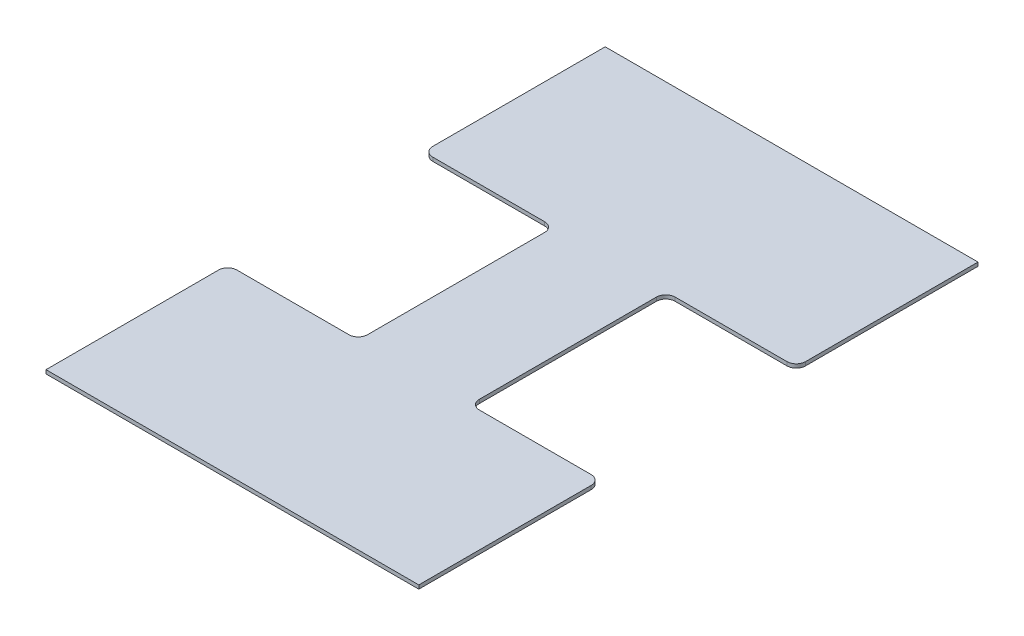
ISO-10303-21;
HEADER;
FILE_DESCRIPTION(('STEP AP214'),'2;1');
FILE_NAME('part.step','',(''),(''),'','','');
FILE_SCHEMA(('AUTOMOTIVE_DESIGN { 1 0 10303 214 1 1 1 1 }'));
ENDSEC;
DATA;
#1=APPLICATION_CONTEXT('core data for automotive mechanical design processes');
#2=APPLICATION_PROTOCOL_DEFINITION('international standard','automotive_design',2000,#1);
#3=PRODUCT_CONTEXT('',#1,'mechanical');
#4=PRODUCT('Part','Part','',(#3));
#5=PRODUCT_RELATED_PRODUCT_CATEGORY('part','',(#4));
#6=PRODUCT_DEFINITION_FORMATION('','',#4);
#7=PRODUCT_DEFINITION_CONTEXT('part definition',#1,'design');
#8=PRODUCT_DEFINITION('design','',#6,#7);
#9=PRODUCT_DEFINITION_SHAPE('','',#8);
#10=(LENGTH_UNIT() NAMED_UNIT(*) SI_UNIT(.MILLI.,.METRE.));
#11=(NAMED_UNIT(*) PLANE_ANGLE_UNIT() SI_UNIT($,.RADIAN.));
#12=(NAMED_UNIT(*) SI_UNIT($,.STERADIAN.) SOLID_ANGLE_UNIT());
#13=UNCERTAINTY_MEASURE_WITH_UNIT(LENGTH_MEASURE(1.E-05),#10,'distance_accuracy_value','');
#14=(GEOMETRIC_REPRESENTATION_CONTEXT(3) GLOBAL_UNCERTAINTY_ASSIGNED_CONTEXT((#13)) GLOBAL_UNIT_ASSIGNED_CONTEXT((#10,
#11,#12)) REPRESENTATION_CONTEXT('',''));
#15=CARTESIAN_POINT('',(0.,0.,0.));
#16=DIRECTION('',(0.,0.,1.));
#17=DIRECTION('',(1.,0.,0.));
#18=AXIS2_PLACEMENT_3D('',#15,#16,#17);
#19=CARTESIAN_POINT('',(200.,4.,300.));
#20=DIRECTION('',(-1.,0.,0.));
#21=DIRECTION('',(0.,0.,1.));
#22=AXIS2_PLACEMENT_3D('',#19,#20,#21);
#23=PLANE('',#22);
#24=DIRECTION('',(0.,0.,-1.));
#25=VECTOR('',#24,1.);
#26=CARTESIAN_POINT('',(200.,4.,300.));
#27=LINE('',#26,#25);
#28=CARTESIAN_POINT('',(200.,4.,-115.));
#29=VERTEX_POINT('',#28);
#30=CARTESIAN_POINT('',(200.,4.,-300.));
#31=VERTEX_POINT('',#30);
#32=EDGE_CURVE('E173',#29,#31,#27,.T.);
#33=ORIENTED_EDGE('',*,*,#32,.F.);
#34=DIRECTION('',(0.,1.,0.));
#35=VECTOR('',#34,1.);
#36=CARTESIAN_POINT('',(200.,0.,-115.));
#37=LINE('',#36,#35);
#38=CARTESIAN_POINT('',(200.,0.,-115.));
#39=VERTEX_POINT('',#38);
#40=EDGE_CURVE('E216',#29,#39,#37,.F.);
#41=ORIENTED_EDGE('',*,*,#40,.T.);
#42=DIRECTION('',(0.,0.,-1.));
#43=VECTOR('',#42,1.);
#44=CARTESIAN_POINT('',(200.,0.,300.));
#45=LINE('',#44,#43);
#46=CARTESIAN_POINT('',(200.,0.,-300.));
#47=VERTEX_POINT('',#46);
#48=EDGE_CURVE('E197',#39,#47,#45,.T.);
#49=ORIENTED_EDGE('',*,*,#48,.T.);
#50=DIRECTION('',(0.,-1.,0.));
#51=VECTOR('',#50,1.);
#52=CARTESIAN_POINT('',(200.,4.,-300.));
#53=LINE('',#52,#51);
#54=EDGE_CURVE('E190',#31,#47,#53,.T.);
#55=ORIENTED_EDGE('',*,*,#54,.F.);
#56=EDGE_LOOP('',(#33,#41,#49,#55));
#57=FACE_BOUND('',#56,.T.);
#58=ADVANCED_FACE('F35',(#57),#23,.F.);
#59=CARTESIAN_POINT('',(200.,0.,300.));
#60=VERTEX_POINT('',#59);
#61=CARTESIAN_POINT('',(200.,0.,115.));
#62=VERTEX_POINT('',#61);
#63=EDGE_CURVE('E305',#60,#62,#45,.T.);
#64=ORIENTED_EDGE('',*,*,#63,.T.);
#65=DIRECTION('',(0.,1.,0.));
#66=VECTOR('',#65,1.);
#67=CARTESIAN_POINT('',(200.,4.,115.));
#68=LINE('',#67,#66);
#69=CARTESIAN_POINT('',(200.,4.,115.));
#70=VERTEX_POINT('',#69);
#71=EDGE_CURVE('E225',#62,#70,#68,.T.);
#72=ORIENTED_EDGE('',*,*,#71,.T.);
#73=CARTESIAN_POINT('',(200.,4.,300.));
#74=VERTEX_POINT('',#73);
#75=EDGE_CURVE('E184',#74,#70,#27,.T.);
#76=ORIENTED_EDGE('',*,*,#75,.F.);
#77=DIRECTION('',(0.,-1.,0.));
#78=VECTOR('',#77,1.);
#79=CARTESIAN_POINT('',(200.,4.,300.));
#80=LINE('',#79,#78);
#81=EDGE_CURVE('E304',#74,#60,#80,.T.);
#82=ORIENTED_EDGE('',*,*,#81,.T.);
#83=EDGE_LOOP('',(#64,#72,#76,#82));
#84=FACE_BOUND('',#83,.T.);
#85=ADVANCED_FACE('F331',(#84),#23,.F.);
#86=CARTESIAN_POINT('',(0.,4.,0.));
#87=DIRECTION('',(0.,-1.,0.));
#88=DIRECTION('',(0.,0.,-1.));
#89=AXIS2_PLACEMENT_3D('',#86,#87,#88);
#90=PLANE('',#89);
#91=DIRECTION('',(1.,0.,0.));
#92=VECTOR('',#91,1.);
#93=CARTESIAN_POINT('',(200.,4.,-105.));
#94=LINE('',#93,#92);
#95=CARTESIAN_POINT('',(70.,4.,-105.));
#96=VERTEX_POINT('',#95);
#97=CARTESIAN_POINT('',(190.,4.,-105.));
#98=VERTEX_POINT('',#97);
#99=EDGE_CURVE('E343',#96,#98,#94,.T.);
#100=ORIENTED_EDGE('',*,*,#99,.T.);
#101=CARTESIAN_POINT('',(190.,4.,-115.));
#102=DIRECTION('',(0.,-1.,0.));
#103=DIRECTION('',(0.,0.,-1.));
#104=AXIS2_PLACEMENT_3D('',#101,#102,#103);
#105=CIRCLE('',#104,10.);
#106=EDGE_CURVE('E180',#98,#29,#105,.F.);
#107=ORIENTED_EDGE('',*,*,#106,.T.);
#108=ORIENTED_EDGE('',*,*,#32,.T.);
#109=DIRECTION('',(-1.,0.,0.));
#110=VECTOR('',#109,1.);
#111=CARTESIAN_POINT('',(-200.,4.,-300.));
#112=LINE('',#111,#110);
#113=CARTESIAN_POINT('',(-200.,4.,-300.));
#114=VERTEX_POINT('',#113);
#115=EDGE_CURVE('E178',#31,#114,#112,.T.);
#116=ORIENTED_EDGE('',*,*,#115,.T.);
#117=DIRECTION('',(0.,0.,1.));
#118=VECTOR('',#117,1.);
#119=CARTESIAN_POINT('',(-200.,4.,300.));
#120=LINE('',#119,#118);
#121=CARTESIAN_POINT('',(-200.,4.,-115.));
#122=VERTEX_POINT('',#121);
#123=EDGE_CURVE('E300',#114,#122,#120,.T.);
#124=ORIENTED_EDGE('',*,*,#123,.T.);
#125=CARTESIAN_POINT('',(-190.,4.,-115.));
#126=DIRECTION('',(0.,-1.,0.));
#127=DIRECTION('',(0.,0.,-1.));
#128=AXIS2_PLACEMENT_3D('',#125,#126,#127);
#129=CIRCLE('',#128,10.);
#130=CARTESIAN_POINT('',(-190.,4.,-105.));
#131=VERTEX_POINT('',#130);
#132=EDGE_CURVE('E209',#122,#131,#129,.F.);
#133=ORIENTED_EDGE('',*,*,#132,.T.);
#134=DIRECTION('',(-1.,0.,0.));
#135=VECTOR('',#134,1.);
#136=CARTESIAN_POINT('',(-200.,4.,-105.));
#137=LINE('',#136,#135);
#138=CARTESIAN_POINT('',(-70.,4.,-105.));
#139=VERTEX_POINT('',#138);
#140=EDGE_CURVE('E272',#139,#131,#137,.T.);
#141=ORIENTED_EDGE('',*,*,#140,.F.);
#142=CARTESIAN_POINT('',(-70.,4.,-95.));
#143=DIRECTION('',(0.,-1.,0.));
#144=DIRECTION('',(0.,0.,-1.));
#145=AXIS2_PLACEMENT_3D('',#142,#143,#144);
#146=CIRCLE('',#145,10.);
#147=CARTESIAN_POINT('',(-60.,4.,-95.));
#148=VERTEX_POINT('',#147);
#149=EDGE_CURVE('E43',#139,#148,#146,.T.);
#150=ORIENTED_EDGE('',*,*,#149,.T.);
#151=DIRECTION('',(0.,0.,-1.));
#152=VECTOR('',#151,1.);
#153=CARTESIAN_POINT('',(-60.,4.,105.));
#154=LINE('',#153,#152);
#155=CARTESIAN_POINT('',(-60.,4.,95.));
#156=VERTEX_POINT('',#155);
#157=EDGE_CURVE('E271',#156,#148,#154,.T.);
#158=ORIENTED_EDGE('',*,*,#157,.F.);
#159=CARTESIAN_POINT('',(-70.,4.,95.));
#160=DIRECTION('',(0.,-1.,0.));
#161=DIRECTION('',(0.,0.,-1.));
#162=AXIS2_PLACEMENT_3D('',#159,#160,#161);
#163=CIRCLE('',#162,10.);
#164=CARTESIAN_POINT('',(-70.,4.,105.));
#165=VERTEX_POINT('',#164);
#166=EDGE_CURVE('E265',#156,#165,#163,.T.);
#167=ORIENTED_EDGE('',*,*,#166,.T.);
#168=DIRECTION('',(1.,0.,0.));
#169=VECTOR('',#168,1.);
#170=CARTESIAN_POINT('',(-200.,4.,105.));
#171=LINE('',#170,#169);
#172=CARTESIAN_POINT('',(-190.,4.,105.));
#173=VERTEX_POINT('',#172);
#174=EDGE_CURVE('E292',#173,#165,#171,.T.);
#175=ORIENTED_EDGE('',*,*,#174,.F.);
#176=CARTESIAN_POINT('',(-190.,4.,115.));
#177=DIRECTION('',(0.,-1.,0.));
#178=DIRECTION('',(0.,0.,-1.));
#179=AXIS2_PLACEMENT_3D('',#176,#177,#178);
#180=CIRCLE('',#179,10.);
#181=CARTESIAN_POINT('',(-200.,4.,115.));
#182=VERTEX_POINT('',#181);
#183=EDGE_CURVE('E211',#173,#182,#180,.F.);
#184=ORIENTED_EDGE('',*,*,#183,.T.);
#185=CARTESIAN_POINT('',(-200.,4.,300.));
#186=VERTEX_POINT('',#185);
#187=EDGE_CURVE('E194',#182,#186,#120,.T.);
#188=ORIENTED_EDGE('',*,*,#187,.T.);
#189=DIRECTION('',(1.,0.,0.));
#190=VECTOR('',#189,1.);
#191=CARTESIAN_POINT('',(-200.,4.,300.));
#192=LINE('',#191,#190);
#193=EDGE_CURVE('E302',#186,#74,#192,.T.);
#194=ORIENTED_EDGE('',*,*,#193,.T.);
#195=ORIENTED_EDGE('',*,*,#75,.T.);
#196=CARTESIAN_POINT('',(190.,4.,115.));
#197=DIRECTION('',(0.,-1.,0.));
#198=DIRECTION('',(0.,0.,-1.));
#199=AXIS2_PLACEMENT_3D('',#196,#197,#198);
#200=CIRCLE('',#199,10.);
#201=CARTESIAN_POINT('',(190.,4.,105.));
#202=VERTEX_POINT('',#201);
#203=EDGE_CURVE('E213',#70,#202,#200,.F.);
#204=ORIENTED_EDGE('',*,*,#203,.T.);
#205=DIRECTION('',(-1.,0.,0.));
#206=VECTOR('',#205,1.);
#207=CARTESIAN_POINT('',(200.,4.,105.));
#208=LINE('',#207,#206);
#209=CARTESIAN_POINT('',(70.,4.,105.));
#210=VERTEX_POINT('',#209);
#211=EDGE_CURVE('E338',#202,#210,#208,.T.);
#212=ORIENTED_EDGE('',*,*,#211,.T.);
#213=CARTESIAN_POINT('',(70.,4.,95.));
#214=DIRECTION('',(0.,-1.,0.));
#215=DIRECTION('',(0.,0.,-1.));
#216=AXIS2_PLACEMENT_3D('',#213,#214,#215);
#217=CIRCLE('',#216,10.);
#218=CARTESIAN_POINT('',(60.,4.,95.));
#219=VERTEX_POINT('',#218);
#220=EDGE_CURVE('E257',#210,#219,#217,.T.);
#221=ORIENTED_EDGE('',*,*,#220,.T.);
#222=DIRECTION('',(0.,0.,-1.));
#223=VECTOR('',#222,1.);
#224=CARTESIAN_POINT('',(60.,4.,105.));
#225=LINE('',#224,#223);
#226=CARTESIAN_POINT('',(60.,4.,-95.));
#227=VERTEX_POINT('',#226);
#228=EDGE_CURVE('E344',#219,#227,#225,.T.);
#229=ORIENTED_EDGE('',*,*,#228,.T.);
#230=CARTESIAN_POINT('',(70.,4.,-95.));
#231=DIRECTION('',(0.,-1.,0.));
#232=DIRECTION('',(0.,0.,-1.));
#233=AXIS2_PLACEMENT_3D('',#230,#231,#232);
#234=CIRCLE('',#233,10.);
#235=EDGE_CURVE('E261',#227,#96,#234,.T.);
#236=ORIENTED_EDGE('',*,*,#235,.T.);
#237=EDGE_LOOP('',(#100,#107,#108,#116,#124,#133,#141,#150,#158,#167,#175,#184,#188,#194,#195,
#204,#212,#221,#229,#236));
#238=FACE_BOUND('',#237,.T.);
#239=ADVANCED_FACE('F176',(#238),#90,.F.);
#240=CARTESIAN_POINT('',(0.,0.,0.));
#241=DIRECTION('',(0.,-1.,0.));
#242=DIRECTION('',(0.,0.,-1.));
#243=AXIS2_PLACEMENT_3D('',#240,#241,#242);
#244=PLANE('',#243);
#245=ORIENTED_EDGE('',*,*,#48,.F.);
#246=CARTESIAN_POINT('',(190.,0.,-115.));
#247=DIRECTION('',(0.,-1.,0.));
#248=DIRECTION('',(0.,0.,-1.));
#249=AXIS2_PLACEMENT_3D('',#246,#247,#248);
#250=CIRCLE('',#249,10.);
#251=CARTESIAN_POINT('',(190.,0.,-105.));
#252=VERTEX_POINT('',#251);
#253=EDGE_CURVE('E223',#39,#252,#250,.T.);
#254=ORIENTED_EDGE('',*,*,#253,.T.);
#255=DIRECTION('',(1.,0.,0.));
#256=VECTOR('',#255,1.);
#257=CARTESIAN_POINT('',(200.,0.,-105.));
#258=LINE('',#257,#256);
#259=CARTESIAN_POINT('',(70.,0.,-105.));
#260=VERTEX_POINT('',#259);
#261=EDGE_CURVE('E281',#260,#252,#258,.T.);
#262=ORIENTED_EDGE('',*,*,#261,.F.);
#263=CARTESIAN_POINT('',(70.,0.,-95.));
#264=DIRECTION('',(0.,-1.,0.));
#265=DIRECTION('',(0.,0.,-1.));
#266=AXIS2_PLACEMENT_3D('',#263,#264,#265);
#267=CIRCLE('',#266,10.);
#268=CARTESIAN_POINT('',(60.,0.,-95.));
#269=VERTEX_POINT('',#268);
#270=EDGE_CURVE('E263',#260,#269,#267,.F.);
#271=ORIENTED_EDGE('',*,*,#270,.T.);
#272=DIRECTION('',(0.,0.,-1.));
#273=VECTOR('',#272,1.);
#274=CARTESIAN_POINT('',(60.,0.,105.));
#275=LINE('',#274,#273);
#276=CARTESIAN_POINT('',(60.,0.,95.));
#277=VERTEX_POINT('',#276);
#278=EDGE_CURVE('E346',#277,#269,#275,.T.);
#279=ORIENTED_EDGE('',*,*,#278,.F.);
#280=CARTESIAN_POINT('',(70.,0.,95.));
#281=DIRECTION('',(0.,-1.,0.));
#282=DIRECTION('',(0.,0.,-1.));
#283=AXIS2_PLACEMENT_3D('',#280,#281,#282);
#284=CIRCLE('',#283,10.);
#285=CARTESIAN_POINT('',(70.,0.,105.));
#286=VERTEX_POINT('',#285);
#287=EDGE_CURVE('E259',#277,#286,#284,.F.);
#288=ORIENTED_EDGE('',*,*,#287,.T.);
#289=DIRECTION('',(-1.,0.,0.));
#290=VECTOR('',#289,1.);
#291=CARTESIAN_POINT('',(200.,0.,105.));
#292=LINE('',#291,#290);
#293=CARTESIAN_POINT('',(190.,0.,105.));
#294=VERTEX_POINT('',#293);
#295=EDGE_CURVE('E352',#294,#286,#292,.T.);
#296=ORIENTED_EDGE('',*,*,#295,.F.);
#297=CARTESIAN_POINT('',(190.,0.,115.));
#298=DIRECTION('',(0.,-1.,0.));
#299=DIRECTION('',(0.,0.,-1.));
#300=AXIS2_PLACEMENT_3D('',#297,#298,#299);
#301=CIRCLE('',#300,10.);
#302=EDGE_CURVE('E221',#294,#62,#301,.T.);
#303=ORIENTED_EDGE('',*,*,#302,.T.);
#304=ORIENTED_EDGE('',*,*,#63,.F.);
#305=DIRECTION('',(1.,0.,0.));
#306=VECTOR('',#305,1.);
#307=CARTESIAN_POINT('',(-200.,0.,300.));
#308=LINE('',#307,#306);
#309=CARTESIAN_POINT('',(-200.,0.,300.));
#310=VERTEX_POINT('',#309);
#311=EDGE_CURVE('E185',#310,#60,#308,.T.);
#312=ORIENTED_EDGE('',*,*,#311,.F.);
#313=DIRECTION('',(0.,0.,1.));
#314=VECTOR('',#313,1.);
#315=CARTESIAN_POINT('',(-200.,0.,300.));
#316=LINE('',#315,#314);
#317=CARTESIAN_POINT('',(-200.,0.,115.));
#318=VERTEX_POINT('',#317);
#319=EDGE_CURVE('E310',#318,#310,#316,.T.);
#320=ORIENTED_EDGE('',*,*,#319,.F.);
#321=CARTESIAN_POINT('',(-190.,0.,115.));
#322=DIRECTION('',(0.,-1.,0.));
#323=DIRECTION('',(0.,0.,-1.));
#324=AXIS2_PLACEMENT_3D('',#321,#322,#323);
#325=CIRCLE('',#324,10.);
#326=CARTESIAN_POINT('',(-190.,0.,105.));
#327=VERTEX_POINT('',#326);
#328=EDGE_CURVE('E219',#318,#327,#325,.T.);
#329=ORIENTED_EDGE('',*,*,#328,.T.);
#330=DIRECTION('',(1.,0.,0.));
#331=VECTOR('',#330,1.);
#332=CARTESIAN_POINT('',(-200.,0.,105.));
#333=LINE('',#332,#331);
#334=CARTESIAN_POINT('',(-70.,0.,105.));
#335=VERTEX_POINT('',#334);
#336=EDGE_CURVE('E288',#327,#335,#333,.T.);
#337=ORIENTED_EDGE('',*,*,#336,.T.);
#338=CARTESIAN_POINT('',(-70.,0.,95.));
#339=DIRECTION('',(0.,-1.,0.));
#340=DIRECTION('',(0.,0.,-1.));
#341=AXIS2_PLACEMENT_3D('',#338,#339,#340);
#342=CIRCLE('',#341,10.);
#343=CARTESIAN_POINT('',(-60.,0.,95.));
#344=VERTEX_POINT('',#343);
#345=EDGE_CURVE('E267',#335,#344,#342,.F.);
#346=ORIENTED_EDGE('',*,*,#345,.T.);
#347=DIRECTION('',(0.,0.,-1.));
#348=VECTOR('',#347,1.);
#349=CARTESIAN_POINT('',(-60.,0.,105.));
#350=LINE('',#349,#348);
#351=CARTESIAN_POINT('',(-60.,0.,-95.));
#352=VERTEX_POINT('',#351);
#353=EDGE_CURVE('E286',#344,#352,#350,.T.);
#354=ORIENTED_EDGE('',*,*,#353,.T.);
#355=CARTESIAN_POINT('',(-70.,0.,-95.));
#356=DIRECTION('',(0.,-1.,0.));
#357=DIRECTION('',(0.,0.,-1.));
#358=AXIS2_PLACEMENT_3D('',#355,#356,#357);
#359=CIRCLE('',#358,10.);
#360=CARTESIAN_POINT('',(-70.,0.,-105.));
#361=VERTEX_POINT('',#360);
#362=EDGE_CURVE('E11',#352,#361,#359,.F.);
#363=ORIENTED_EDGE('',*,*,#362,.T.);
#364=DIRECTION('',(-1.,0.,0.));
#365=VECTOR('',#364,1.);
#366=CARTESIAN_POINT('',(-200.,0.,-105.));
#367=LINE('',#366,#365);
#368=CARTESIAN_POINT('',(-190.,0.,-105.));
#369=VERTEX_POINT('',#368);
#370=EDGE_CURVE('E285',#361,#369,#367,.T.);
#371=ORIENTED_EDGE('',*,*,#370,.T.);
#372=CARTESIAN_POINT('',(-190.,0.,-115.));
#373=DIRECTION('',(0.,-1.,0.));
#374=DIRECTION('',(0.,0.,-1.));
#375=AXIS2_PLACEMENT_3D('',#372,#373,#374);
#376=CIRCLE('',#375,10.);
#377=CARTESIAN_POINT('',(-200.,0.,-115.));
#378=VERTEX_POINT('',#377);
#379=EDGE_CURVE('E50',#369,#378,#376,.T.);
#380=ORIENTED_EDGE('',*,*,#379,.T.);
#381=CARTESIAN_POINT('',(-200.,0.,-300.));
#382=VERTEX_POINT('',#381);
#383=EDGE_CURVE('E311',#382,#378,#316,.T.);
#384=ORIENTED_EDGE('',*,*,#383,.F.);
#385=DIRECTION('',(-1.,0.,0.));
#386=VECTOR('',#385,1.);
#387=CARTESIAN_POINT('',(-200.,0.,-300.));
#388=LINE('',#387,#386);
#389=EDGE_CURVE('E308',#47,#382,#388,.T.);
#390=ORIENTED_EDGE('',*,*,#389,.F.);
#391=EDGE_LOOP('',(#245,#254,#262,#271,#279,#288,#296,#303,#304,#312,#320,#329,#337,#346,#354,
#363,#371,#380,#384,#390));
#392=FACE_BOUND('',#391,.T.);
#393=ADVANCED_FACE('F284',(#392),#244,.T.);
#394=CARTESIAN_POINT('',(-200.,4.,300.));
#395=DIRECTION('',(1.,0.,0.));
#396=DIRECTION('',(0.,0.,-1.));
#397=AXIS2_PLACEMENT_3D('',#394,#395,#396);
#398=PLANE('',#397);
#399=ORIENTED_EDGE('',*,*,#187,.F.);
#400=DIRECTION('',(0.,1.,0.));
#401=VECTOR('',#400,1.);
#402=CARTESIAN_POINT('',(-200.,4.,115.));
#403=LINE('',#402,#401);
#404=EDGE_CURVE('E243',#182,#318,#403,.F.);
#405=ORIENTED_EDGE('',*,*,#404,.T.);
#406=ORIENTED_EDGE('',*,*,#319,.T.);
#407=DIRECTION('',(0.,-1.,0.));
#408=VECTOR('',#407,1.);
#409=CARTESIAN_POINT('',(-200.,4.,300.));
#410=LINE('',#409,#408);
#411=EDGE_CURVE('E203',#186,#310,#410,.T.);
#412=ORIENTED_EDGE('',*,*,#411,.F.);
#413=EDGE_LOOP('',(#399,#405,#406,#412));
#414=FACE_BOUND('',#413,.T.);
#415=ADVANCED_FACE('F499',(#414),#398,.F.);
#416=CARTESIAN_POINT('',(-200.,4.,-300.));
#417=DIRECTION('',(0.,0.,1.));
#418=DIRECTION('',(1.,0.,0.));
#419=AXIS2_PLACEMENT_3D('',#416,#417,#418);
#420=PLANE('',#419);
#421=ORIENTED_EDGE('',*,*,#389,.T.);
#422=DIRECTION('',(0.,-1.,0.));
#423=VECTOR('',#422,1.);
#424=CARTESIAN_POINT('',(-200.,4.,-300.));
#425=LINE('',#424,#423);
#426=EDGE_CURVE('E192',#114,#382,#425,.T.);
#427=ORIENTED_EDGE('',*,*,#426,.F.);
#428=ORIENTED_EDGE('',*,*,#115,.F.);
#429=ORIENTED_EDGE('',*,*,#54,.T.);
#430=EDGE_LOOP('',(#421,#427,#428,#429));
#431=FACE_BOUND('',#430,.T.);
#432=ADVANCED_FACE('F189',(#431),#420,.F.);
#433=ORIENTED_EDGE('',*,*,#383,.T.);
#434=DIRECTION('',(0.,1.,0.));
#435=VECTOR('',#434,1.);
#436=CARTESIAN_POINT('',(-200.,4.,-115.));
#437=LINE('',#436,#435);
#438=EDGE_CURVE('E245',#378,#122,#437,.T.);
#439=ORIENTED_EDGE('',*,*,#438,.T.);
#440=ORIENTED_EDGE('',*,*,#123,.F.);
#441=ORIENTED_EDGE('',*,*,#426,.T.);
#442=EDGE_LOOP('',(#433,#439,#440,#441));
#443=FACE_BOUND('',#442,.T.);
#444=ADVANCED_FACE('F375',(#443),#398,.F.);
#445=CARTESIAN_POINT('',(-200.,4.,300.));
#446=DIRECTION('',(0.,0.,-1.));
#447=DIRECTION('',(-1.,0.,0.));
#448=AXIS2_PLACEMENT_3D('',#445,#446,#447);
#449=PLANE('',#448);
#450=ORIENTED_EDGE('',*,*,#311,.T.);
#451=ORIENTED_EDGE('',*,*,#81,.F.);
#452=ORIENTED_EDGE('',*,*,#193,.F.);
#453=ORIENTED_EDGE('',*,*,#411,.T.);
#454=EDGE_LOOP('',(#450,#451,#452,#453));
#455=FACE_BOUND('',#454,.T.);
#456=ADVANCED_FACE('F320',(#455),#449,.F.);
#457=CARTESIAN_POINT('',(-60.,0.,105.));
#458=DIRECTION('',(1.,0.,0.));
#459=DIRECTION('',(0.,0.,-1.));
#460=AXIS2_PLACEMENT_3D('',#457,#458,#459);
#461=PLANE('',#460);
#462=ORIENTED_EDGE('',*,*,#353,.F.);
#463=DIRECTION('',(0.,1.,0.));
#464=VECTOR('',#463,1.);
#465=CARTESIAN_POINT('',(-60.,4.,95.));
#466=LINE('',#465,#464);
#467=EDGE_CURVE('E254',#344,#156,#466,.T.);
#468=ORIENTED_EDGE('',*,*,#467,.T.);
#469=ORIENTED_EDGE('',*,*,#157,.T.);
#470=DIRECTION('',(0.,1.,0.));
#471=VECTOR('',#470,1.);
#472=CARTESIAN_POINT('',(-60.,0.,-95.));
#473=LINE('',#472,#471);
#474=EDGE_CURVE('E252',#148,#352,#473,.F.);
#475=ORIENTED_EDGE('',*,*,#474,.T.);
#476=EDGE_LOOP('',(#462,#468,#469,#475));
#477=FACE_BOUND('',#476,.T.);
#478=ADVANCED_FACE('F278',(#477),#461,.F.);
#479=CARTESIAN_POINT('',(-200.,0.,105.));
#480=DIRECTION('',(0.,0.,1.));
#481=DIRECTION('',(1.,0.,0.));
#482=AXIS2_PLACEMENT_3D('',#479,#480,#481);
#483=PLANE('',#482);
#484=ORIENTED_EDGE('',*,*,#336,.F.);
#485=DIRECTION('',(0.,1.,0.));
#486=VECTOR('',#485,1.);
#487=CARTESIAN_POINT('',(-190.,0.,105.));
#488=LINE('',#487,#486);
#489=EDGE_CURVE('E240',#327,#173,#488,.T.);
#490=ORIENTED_EDGE('',*,*,#489,.T.);
#491=ORIENTED_EDGE('',*,*,#174,.T.);
#492=DIRECTION('',(0.,1.,0.));
#493=VECTOR('',#492,1.);
#494=CARTESIAN_POINT('',(-70.,0.,105.));
#495=LINE('',#494,#493);
#496=EDGE_CURVE('E238',#165,#335,#495,.F.);
#497=ORIENTED_EDGE('',*,*,#496,.T.);
#498=EDGE_LOOP('',(#484,#490,#491,#497));
#499=FACE_BOUND('',#498,.T.);
#500=ADVANCED_FACE('F508',(#499),#483,.F.);
#501=CARTESIAN_POINT('',(-200.,0.,-105.));
#502=DIRECTION('',(0.,0.,-1.));
#503=DIRECTION('',(-1.,0.,0.));
#504=AXIS2_PLACEMENT_3D('',#501,#502,#503);
#505=PLANE('',#504);
#506=ORIENTED_EDGE('',*,*,#140,.T.);
#507=DIRECTION('',(0.,1.,0.));
#508=VECTOR('',#507,1.);
#509=CARTESIAN_POINT('',(-190.,0.,-105.));
#510=LINE('',#509,#508);
#511=EDGE_CURVE('E58',#131,#369,#510,.F.);
#512=ORIENTED_EDGE('',*,*,#511,.T.);
#513=ORIENTED_EDGE('',*,*,#370,.F.);
#514=DIRECTION('',(0.,1.,0.));
#515=VECTOR('',#514,1.);
#516=CARTESIAN_POINT('',(-70.,4.,-105.));
#517=LINE('',#516,#515);
#518=EDGE_CURVE('E248',#361,#139,#517,.T.);
#519=ORIENTED_EDGE('',*,*,#518,.T.);
#520=EDGE_LOOP('',(#506,#512,#513,#519));
#521=FACE_BOUND('',#520,.T.);
#522=ADVANCED_FACE('F287',(#521),#505,.F.);
#523=CARTESIAN_POINT('',(60.,0.,105.));
#524=DIRECTION('',(1.,0.,0.));
#525=DIRECTION('',(0.,0.,-1.));
#526=AXIS2_PLACEMENT_3D('',#523,#524,#525);
#527=PLANE('',#526);
#528=ORIENTED_EDGE('',*,*,#228,.F.);
#529=DIRECTION('',(0.,1.,0.));
#530=VECTOR('',#529,1.);
#531=CARTESIAN_POINT('',(60.,0.,95.));
#532=LINE('',#531,#530);
#533=EDGE_CURVE('E236',#219,#277,#532,.F.);
#534=ORIENTED_EDGE('',*,*,#533,.T.);
#535=ORIENTED_EDGE('',*,*,#278,.T.);
#536=DIRECTION('',(0.,1.,0.));
#537=VECTOR('',#536,1.);
#538=CARTESIAN_POINT('',(60.,4.,-95.));
#539=LINE('',#538,#537);
#540=EDGE_CURVE('E233',#269,#227,#539,.T.);
#541=ORIENTED_EDGE('',*,*,#540,.T.);
#542=EDGE_LOOP('',(#528,#534,#535,#541));
#543=FACE_BOUND('',#542,.T.);
#544=ADVANCED_FACE('F359',(#543),#527,.T.);
#545=CARTESIAN_POINT('',(200.,0.,-105.));
#546=DIRECTION('',(0.,0.,1.));
#547=DIRECTION('',(1.,0.,0.));
#548=AXIS2_PLACEMENT_3D('',#545,#546,#547);
#549=PLANE('',#548);
#550=ORIENTED_EDGE('',*,*,#261,.T.);
#551=DIRECTION('',(0.,1.,0.));
#552=VECTOR('',#551,1.);
#553=CARTESIAN_POINT('',(190.,4.,-105.));
#554=LINE('',#553,#552);
#555=EDGE_CURVE('E201',#252,#98,#554,.T.);
#556=ORIENTED_EDGE('',*,*,#555,.T.);
#557=ORIENTED_EDGE('',*,*,#99,.F.);
#558=DIRECTION('',(0.,1.,0.));
#559=VECTOR('',#558,1.);
#560=CARTESIAN_POINT('',(70.,0.,-105.));
#561=LINE('',#560,#559);
#562=EDGE_CURVE('E199',#96,#260,#561,.F.);
#563=ORIENTED_EDGE('',*,*,#562,.T.);
#564=EDGE_LOOP('',(#550,#556,#557,#563));
#565=FACE_BOUND('',#564,.T.);
#566=ADVANCED_FACE('F368',(#565),#549,.T.);
#567=CARTESIAN_POINT('',(200.,0.,105.));
#568=DIRECTION('',(0.,0.,-1.));
#569=DIRECTION('',(-1.,0.,0.));
#570=AXIS2_PLACEMENT_3D('',#567,#568,#569);
#571=PLANE('',#570);
#572=ORIENTED_EDGE('',*,*,#211,.F.);
#573=DIRECTION('',(0.,1.,0.));
#574=VECTOR('',#573,1.);
#575=CARTESIAN_POINT('',(190.,0.,105.));
#576=LINE('',#575,#574);
#577=EDGE_CURVE('E231',#202,#294,#576,.F.);
#578=ORIENTED_EDGE('',*,*,#577,.T.);
#579=ORIENTED_EDGE('',*,*,#295,.T.);
#580=DIRECTION('',(0.,1.,0.));
#581=VECTOR('',#580,1.);
#582=CARTESIAN_POINT('',(70.,4.,105.));
#583=LINE('',#582,#581);
#584=EDGE_CURVE('E228',#286,#210,#583,.T.);
#585=ORIENTED_EDGE('',*,*,#584,.T.);
#586=EDGE_LOOP('',(#572,#578,#579,#585));
#587=FACE_BOUND('',#586,.T.);
#588=ADVANCED_FACE('F340',(#587),#571,.T.);
#589=CARTESIAN_POINT('',(190.,0.,-115.));
#590=DIRECTION('',(0.,-1.,0.));
#591=DIRECTION('',(0.,0.,-1.));
#592=AXIS2_PLACEMENT_3D('',#589,#590,#591);
#593=CYLINDRICAL_SURFACE('',#592,10.);
#594=ORIENTED_EDGE('',*,*,#253,.F.);
#595=ORIENTED_EDGE('',*,*,#40,.F.);
#596=ORIENTED_EDGE('',*,*,#106,.F.);
#597=ORIENTED_EDGE('',*,*,#555,.F.);
#598=EDGE_LOOP('',(#594,#595,#596,#597));
#599=FACE_BOUND('',#598,.T.);
#600=ADVANCED_FACE('F373',(#599),#593,.T.);
#601=CARTESIAN_POINT('',(190.,4.,115.));
#602=DIRECTION('',(0.,-1.,0.));
#603=DIRECTION('',(0.,0.,-1.));
#604=AXIS2_PLACEMENT_3D('',#601,#602,#603);
#605=CYLINDRICAL_SURFACE('',#604,10.);
#606=ORIENTED_EDGE('',*,*,#302,.F.);
#607=ORIENTED_EDGE('',*,*,#577,.F.);
#608=ORIENTED_EDGE('',*,*,#203,.F.);
#609=ORIENTED_EDGE('',*,*,#71,.F.);
#610=EDGE_LOOP('',(#606,#607,#608,#609));
#611=FACE_BOUND('',#610,.T.);
#612=ADVANCED_FACE('F334',(#611),#605,.T.);
#613=CARTESIAN_POINT('',(70.,0.,95.));
#614=DIRECTION('',(0.,-1.,0.));
#615=DIRECTION('',(0.,0.,-1.));
#616=AXIS2_PLACEMENT_3D('',#613,#614,#615);
#617=CYLINDRICAL_SURFACE('',#616,10.);
#618=ORIENTED_EDGE('',*,*,#287,.F.);
#619=ORIENTED_EDGE('',*,*,#533,.F.);
#620=ORIENTED_EDGE('',*,*,#220,.F.);
#621=ORIENTED_EDGE('',*,*,#584,.F.);
#622=EDGE_LOOP('',(#618,#619,#620,#621));
#623=FACE_BOUND('',#622,.T.);
#624=ADVANCED_FACE('F403',(#623),#617,.F.);
#625=CARTESIAN_POINT('',(70.,0.,-95.));
#626=DIRECTION('',(0.,-1.,0.));
#627=DIRECTION('',(0.,0.,-1.));
#628=AXIS2_PLACEMENT_3D('',#625,#626,#627);
#629=CYLINDRICAL_SURFACE('',#628,10.);
#630=ORIENTED_EDGE('',*,*,#270,.F.);
#631=ORIENTED_EDGE('',*,*,#562,.F.);
#632=ORIENTED_EDGE('',*,*,#235,.F.);
#633=ORIENTED_EDGE('',*,*,#540,.F.);
#634=EDGE_LOOP('',(#630,#631,#632,#633));
#635=FACE_BOUND('',#634,.T.);
#636=ADVANCED_FACE('F364',(#635),#629,.F.);
#637=CARTESIAN_POINT('',(-190.,0.,115.));
#638=DIRECTION('',(0.,1.,0.));
#639=DIRECTION('',(0.,0.,1.));
#640=AXIS2_PLACEMENT_3D('',#637,#638,#639);
#641=CYLINDRICAL_SURFACE('',#640,10.);
#642=ORIENTED_EDGE('',*,*,#328,.F.);
#643=ORIENTED_EDGE('',*,*,#404,.F.);
#644=ORIENTED_EDGE('',*,*,#183,.F.);
#645=ORIENTED_EDGE('',*,*,#489,.F.);
#646=EDGE_LOOP('',(#642,#643,#644,#645));
#647=FACE_BOUND('',#646,.T.);
#648=ADVANCED_FACE('F381',(#647),#641,.T.);
#649=CARTESIAN_POINT('',(-190.,4.,-115.));
#650=DIRECTION('',(0.,1.,0.));
#651=DIRECTION('',(0.,0.,1.));
#652=AXIS2_PLACEMENT_3D('',#649,#650,#651);
#653=CYLINDRICAL_SURFACE('',#652,10.);
#654=ORIENTED_EDGE('',*,*,#379,.F.);
#655=ORIENTED_EDGE('',*,*,#511,.F.);
#656=ORIENTED_EDGE('',*,*,#132,.F.);
#657=ORIENTED_EDGE('',*,*,#438,.F.);
#658=EDGE_LOOP('',(#654,#655,#656,#657));
#659=FACE_BOUND('',#658,.T.);
#660=ADVANCED_FACE('F378',(#659),#653,.T.);
#661=CARTESIAN_POINT('',(-70.,0.,95.));
#662=DIRECTION('',(0.,-1.,0.));
#663=DIRECTION('',(0.,0.,-1.));
#664=AXIS2_PLACEMENT_3D('',#661,#662,#663);
#665=CYLINDRICAL_SURFACE('',#664,10.);
#666=ORIENTED_EDGE('',*,*,#345,.F.);
#667=ORIENTED_EDGE('',*,*,#496,.F.);
#668=ORIENTED_EDGE('',*,*,#166,.F.);
#669=ORIENTED_EDGE('',*,*,#467,.F.);
#670=EDGE_LOOP('',(#666,#667,#668,#669));
#671=FACE_BOUND('',#670,.T.);
#672=ADVANCED_FACE('F380',(#671),#665,.F.);
#673=CARTESIAN_POINT('',(-70.,0.,-95.));
#674=DIRECTION('',(0.,-1.,0.));
#675=DIRECTION('',(0.,0.,-1.));
#676=AXIS2_PLACEMENT_3D('',#673,#674,#675);
#677=CYLINDRICAL_SURFACE('',#676,10.);
#678=ORIENTED_EDGE('',*,*,#362,.F.);
#679=ORIENTED_EDGE('',*,*,#474,.F.);
#680=ORIENTED_EDGE('',*,*,#149,.F.);
#681=ORIENTED_EDGE('',*,*,#518,.F.);
#682=EDGE_LOOP('',(#678,#679,#680,#681));
#683=FACE_BOUND('',#682,.T.);
#684=ADVANCED_FACE('F37',(#683),#677,.F.);
#685=CLOSED_SHELL('',(#58,#85,#239,#393,#415,#432,#444,#456,#478,#500,#522,#544,#566,#588,#600,
#612,#624,#636,#648,#660,#672,#684));
#686=MANIFOLD_SOLID_BREP('B2',#685);
#687=ADVANCED_BREP_SHAPE_REPRESENTATION('',(#18,#686),#14);
#688=SHAPE_DEFINITION_REPRESENTATION(#9,#687);
ENDSEC;
END-ISO-10303-21;
